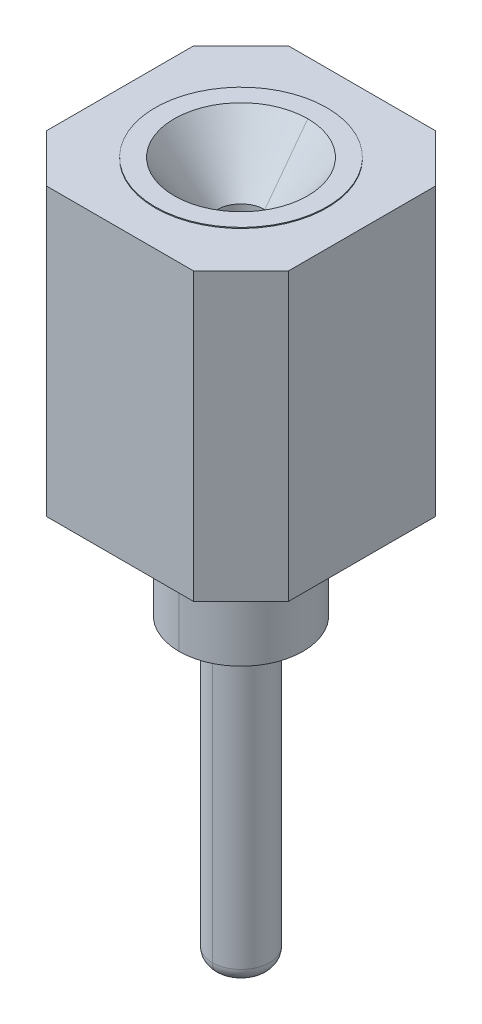
ISO-10303-21;
HEADER;
FILE_DESCRIPTION(('STEP AP214'),'2;1');
FILE_NAME('part.step','',(''),(''),'','','');
FILE_SCHEMA(('AUTOMOTIVE_DESIGN { 1 0 10303 214 1 1 1 1 }'));
ENDSEC;
DATA;
#1=APPLICATION_CONTEXT('core data for automotive mechanical design processes');
#2=APPLICATION_PROTOCOL_DEFINITION('international standard','automotive_design',2000,#1);
#3=PRODUCT_CONTEXT('',#1,'mechanical');
#4=PRODUCT('Part','Part','',(#3));
#5=PRODUCT_RELATED_PRODUCT_CATEGORY('part','',(#4));
#6=PRODUCT_DEFINITION_FORMATION('','',#4);
#7=PRODUCT_DEFINITION_CONTEXT('part definition',#1,'design');
#8=PRODUCT_DEFINITION('design','',#6,#7);
#9=PRODUCT_DEFINITION_SHAPE('','',#8);
#10=(LENGTH_UNIT() NAMED_UNIT(*) SI_UNIT(.MILLI.,.METRE.));
#11=(NAMED_UNIT(*) PLANE_ANGLE_UNIT() SI_UNIT($,.RADIAN.));
#12=(NAMED_UNIT(*) SI_UNIT($,.STERADIAN.) SOLID_ANGLE_UNIT());
#13=UNCERTAINTY_MEASURE_WITH_UNIT(LENGTH_MEASURE(1.E-05),#10,'distance_accuracy_value','');
#14=(GEOMETRIC_REPRESENTATION_CONTEXT(3) GLOBAL_UNCERTAINTY_ASSIGNED_CONTEXT((#13)) GLOBAL_UNIT_ASSIGNED_CONTEXT((#10,
#11,#12)) REPRESENTATION_CONTEXT('',''));
#15=CARTESIAN_POINT('',(0.,0.,0.));
#16=DIRECTION('',(0.,0.,1.));
#17=DIRECTION('',(1.,0.,0.));
#18=AXIS2_PLACEMENT_3D('',#15,#16,#17);
#19=CARTESIAN_POINT('',(0.,-2.85,0.));
#20=DIRECTION('',(0.,1.,0.));
#21=DIRECTION('',(0.,0.,1.));
#22=AXIS2_PLACEMENT_3D('',#19,#20,#21);
#23=DEGENERATE_TOROIDAL_SURFACE('',#22,0.149999999999997,0.15,.T.);
#24=CARTESIAN_POINT('',(0.,-3.,0.));
#25=DIRECTION('',(0.,-1.,0.));
#26=DIRECTION('',(0.,0.,1.));
#27=AXIS2_PLACEMENT_3D('',#24,#25,#26);
#28=CIRCLE('',#27,0.149999999999997);
#29=CARTESIAN_POINT('',(0.,-3.,-0.149999999999997));
#30=VERTEX_POINT('',#29);
#31=CARTESIAN_POINT('',(0.,-3.,0.149999999999997));
#32=VERTEX_POINT('',#31);
#33=EDGE_CURVE('E11',#30,#32,#28,.T.);
#34=ORIENTED_EDGE('',*,*,#33,.F.);
#35=CARTESIAN_POINT('',(0.,-2.85,-0.149999999999997));
#36=DIRECTION('',(1.,0.,0.));
#37=DIRECTION('',(0.,0.,-1.));
#38=AXIS2_PLACEMENT_3D('',#35,#36,#37);
#39=CIRCLE('',#38,0.15);
#40=CARTESIAN_POINT('',(0.,-2.85,-0.299999999999997));
#41=VERTEX_POINT('',#40);
#42=EDGE_CURVE('E24',#30,#41,#39,.T.);
#43=ORIENTED_EDGE('',*,*,#42,.T.);
#44=CARTESIAN_POINT('',(0.,-2.85,0.));
#45=DIRECTION('',(0.,1.,0.));
#46=DIRECTION('',(0.,0.,1.));
#47=AXIS2_PLACEMENT_3D('',#44,#45,#46);
#48=CIRCLE('',#47,0.299999999999997);
#49=CARTESIAN_POINT('',(0.,-2.85,0.299999999999997));
#50=VERTEX_POINT('',#49);
#51=EDGE_CURVE('E288',#50,#41,#48,.T.);
#52=ORIENTED_EDGE('',*,*,#51,.F.);
#53=CARTESIAN_POINT('',(0.,-2.85,0.149999999999997));
#54=DIRECTION('',(-1.,0.,0.));
#55=DIRECTION('',(0.,0.,1.));
#56=AXIS2_PLACEMENT_3D('',#53,#54,#55);
#57=CIRCLE('',#56,0.15);
#58=EDGE_CURVE('E285',#32,#50,#57,.T.);
#59=ORIENTED_EDGE('',*,*,#58,.F.);
#60=EDGE_LOOP('',(#34,#43,#52,#59));
#61=FACE_BOUND('',#60,.T.);
#62=ADVANCED_FACE('F17',(#61),#23,.T.);
#63=CARTESIAN_POINT('',(0.,-3.,0.));
#64=DIRECTION('',(0.,1.,0.));
#65=DIRECTION('',(0.,0.,1.));
#66=AXIS2_PLACEMENT_3D('',#63,#64,#65);
#67=CYLINDRICAL_SURFACE('',#66,0.299999999999997);
#68=ORIENTED_EDGE('',*,*,#51,.T.);
#69=DIRECTION('',(0.,1.,0.));
#70=VECTOR('',#69,1.);
#71=CARTESIAN_POINT('',(0.,-3.,-0.299999999999997));
#72=LINE('',#71,#70);
#73=CARTESIAN_POINT('',(0.,0.,-0.299999999999997));
#74=VERTEX_POINT('',#73);
#75=EDGE_CURVE('E283',#41,#74,#72,.T.);
#76=ORIENTED_EDGE('',*,*,#75,.T.);
#77=CARTESIAN_POINT('',(0.,0.,0.));
#78=DIRECTION('',(0.,-1.,0.));
#79=DIRECTION('',(0.,0.,1.));
#80=AXIS2_PLACEMENT_3D('',#77,#78,#79);
#81=CIRCLE('',#80,0.299999999999997);
#82=CARTESIAN_POINT('',(0.,0.,0.299999999999997));
#83=VERTEX_POINT('',#82);
#84=EDGE_CURVE('E281',#74,#83,#81,.T.);
#85=ORIENTED_EDGE('',*,*,#84,.T.);
#86=DIRECTION('',(0.,1.,0.));
#87=VECTOR('',#86,1.);
#88=CARTESIAN_POINT('',(0.,-3.,0.299999999999997));
#89=LINE('',#88,#87);
#90=EDGE_CURVE('E278',#50,#83,#89,.T.);
#91=ORIENTED_EDGE('',*,*,#90,.F.);
#92=EDGE_LOOP('',(#68,#76,#85,#91));
#93=FACE_BOUND('',#92,.T.);
#94=ADVANCED_FACE('F296',(#93),#67,.T.);
#95=CARTESIAN_POINT('',(0.,0.15,0.));
#96=DIRECTION('',(0.,1.,0.));
#97=DIRECTION('',(0.,0.,1.));
#98=AXIS2_PLACEMENT_3D('',#95,#96,#97);
#99=CONICAL_SURFACE('',#98,0.65,1.16590454050982);
#100=ORIENTED_EDGE('',*,*,#84,.F.);
#101=DIRECTION('',(0.,0.393919298579166,-0.919145030018059));
#102=VECTOR('',#101,1.);
#103=CARTESIAN_POINT('',(0.,0.15,-0.65));
#104=LINE('',#103,#102);
#105=CARTESIAN_POINT('',(0.,0.15,-0.65));
#106=VERTEX_POINT('',#105);
#107=EDGE_CURVE('E276',#74,#106,#104,.T.);
#108=ORIENTED_EDGE('',*,*,#107,.T.);
#109=CARTESIAN_POINT('',(0.,0.15,0.));
#110=DIRECTION('',(0.,1.,0.));
#111=DIRECTION('',(0.,0.,1.));
#112=AXIS2_PLACEMENT_3D('',#109,#110,#111);
#113=CIRCLE('',#112,0.65);
#114=CARTESIAN_POINT('',(0.,0.15,0.65));
#115=VERTEX_POINT('',#114);
#116=EDGE_CURVE('E273',#115,#106,#113,.T.);
#117=ORIENTED_EDGE('',*,*,#116,.F.);
#118=DIRECTION('',(0.,0.393919298579166,0.919145030018059));
#119=VECTOR('',#118,1.);
#120=CARTESIAN_POINT('',(0.,0.15,0.65));
#121=LINE('',#120,#119);
#122=EDGE_CURVE('E270',#83,#115,#121,.T.);
#123=ORIENTED_EDGE('',*,*,#122,.F.);
#124=EDGE_LOOP('',(#100,#108,#117,#123));
#125=FACE_BOUND('',#124,.T.);
#126=ADVANCED_FACE('F375',(#125),#99,.T.);
#127=CARTESIAN_POINT('',(0.,3.71,0.));
#128=DIRECTION('',(0.,1.,0.));
#129=DIRECTION('',(0.,0.,1.));
#130=AXIS2_PLACEMENT_3D('',#127,#128,#129);
#131=CONICAL_SURFACE('',#130,0.25,0.643501108793284);
#132=CARTESIAN_POINT('',(0.,3.71,0.));
#133=DIRECTION('',(0.,1.,0.));
#134=DIRECTION('',(0.,0.,1.));
#135=AXIS2_PLACEMENT_3D('',#132,#133,#134);
#136=CIRCLE('',#135,0.25);
#137=CARTESIAN_POINT('',(0.,3.71,-0.25));
#138=VERTEX_POINT('',#137);
#139=CARTESIAN_POINT('',(0.,3.71,0.25));
#140=VERTEX_POINT('',#139);
#141=EDGE_CURVE('E267',#138,#140,#136,.T.);
#142=ORIENTED_EDGE('',*,*,#141,.F.);
#143=DIRECTION('',(0.,0.8,-0.6));
#144=VECTOR('',#143,1.);
#145=CARTESIAN_POINT('',(0.,3.71,-0.25));
#146=LINE('',#145,#144);
#147=CARTESIAN_POINT('',(0.,4.31,-0.700000000000002));
#148=VERTEX_POINT('',#147);
#149=EDGE_CURVE('E264',#138,#148,#146,.T.);
#150=ORIENTED_EDGE('',*,*,#149,.T.);
#151=CARTESIAN_POINT('',(0.,4.31,0.));
#152=DIRECTION('',(0.,-1.,0.));
#153=DIRECTION('',(0.,0.,1.));
#154=AXIS2_PLACEMENT_3D('',#151,#152,#153);
#155=CIRCLE('',#154,0.700000000000002);
#156=CARTESIAN_POINT('',(0.,4.31,0.700000000000002));
#157=VERTEX_POINT('',#156);
#158=EDGE_CURVE('E262',#157,#148,#155,.T.);
#159=ORIENTED_EDGE('',*,*,#158,.F.);
#160=DIRECTION('',(0.,0.8,0.6));
#161=VECTOR('',#160,1.);
#162=CARTESIAN_POINT('',(0.,3.71,0.25));
#163=LINE('',#162,#161);
#164=EDGE_CURVE('E260',#140,#157,#163,.T.);
#165=ORIENTED_EDGE('',*,*,#164,.F.);
#166=EDGE_LOOP('',(#142,#150,#159,#165));
#167=FACE_BOUND('',#166,.T.);
#168=ADVANCED_FACE('F379',(#167),#131,.F.);
#169=CARTESIAN_POINT('',(0.,4.3,0.));
#170=DIRECTION('',(0.,-1.,0.));
#171=DIRECTION('',(0.,0.,-1.));
#172=AXIS2_PLACEMENT_3D('',#169,#170,#171);
#173=CYLINDRICAL_SURFACE('',#172,0.5);
#174=CARTESIAN_POINT('',(0.,2.3,0.));
#175=DIRECTION('',(0.,1.,0.));
#176=DIRECTION('',(0.,0.,1.));
#177=AXIS2_PLACEMENT_3D('',#174,#175,#176);
#178=CIRCLE('',#177,0.5);
#179=CARTESIAN_POINT('',(0.,2.3,-0.5));
#180=VERTEX_POINT('',#179);
#181=CARTESIAN_POINT('',(0.,2.3,0.5));
#182=VERTEX_POINT('',#181);
#183=EDGE_CURVE('E257',#180,#182,#178,.T.);
#184=ORIENTED_EDGE('',*,*,#183,.T.);
#185=DIRECTION('',(0.,-1.,0.));
#186=VECTOR('',#185,1.);
#187=CARTESIAN_POINT('',(0.,4.3,0.5));
#188=LINE('',#187,#186);
#189=CARTESIAN_POINT('',(0.,1.3,0.5));
#190=VERTEX_POINT('',#189);
#191=EDGE_CURVE('E254',#182,#190,#188,.T.);
#192=ORIENTED_EDGE('',*,*,#191,.T.);
#193=CARTESIAN_POINT('',(0.,1.3,0.));
#194=DIRECTION('',(0.,-1.,0.));
#195=DIRECTION('',(0.,0.,1.));
#196=AXIS2_PLACEMENT_3D('',#193,#194,#195);
#197=CIRCLE('',#196,0.5);
#198=CARTESIAN_POINT('',(0.,1.3,-0.5));
#199=VERTEX_POINT('',#198);
#200=EDGE_CURVE('E251',#190,#199,#197,.T.);
#201=ORIENTED_EDGE('',*,*,#200,.T.);
#202=DIRECTION('',(0.,-1.,0.));
#203=VECTOR('',#202,1.);
#204=CARTESIAN_POINT('',(0.,4.3,-0.5));
#205=LINE('',#204,#203);
#206=EDGE_CURVE('E249',#180,#199,#205,.T.);
#207=ORIENTED_EDGE('',*,*,#206,.F.);
#208=EDGE_LOOP('',(#184,#192,#201,#207));
#209=FACE_BOUND('',#208,.T.);
#210=ADVANCED_FACE('F385',(#209),#173,.F.);
#211=CARTESIAN_POINT('',(0.,2.3,0.));
#212=DIRECTION('',(0.,1.,0.));
#213=DIRECTION('',(0.,0.,1.));
#214=AXIS2_PLACEMENT_3D('',#211,#212,#213);
#215=CYLINDRICAL_SURFACE('',#214,0.25);
#216=CARTESIAN_POINT('',(0.,2.3,0.));
#217=DIRECTION('',(0.,1.,0.));
#218=DIRECTION('',(0.,0.,1.));
#219=AXIS2_PLACEMENT_3D('',#216,#217,#218);
#220=CIRCLE('',#219,0.25);
#221=CARTESIAN_POINT('',(0.,2.3,-0.25));
#222=VERTEX_POINT('',#221);
#223=CARTESIAN_POINT('',(0.,2.3,0.25));
#224=VERTEX_POINT('',#223);
#225=EDGE_CURVE('E246',#222,#224,#220,.T.);
#226=ORIENTED_EDGE('',*,*,#225,.F.);
#227=DIRECTION('',(0.,1.,0.));
#228=VECTOR('',#227,1.);
#229=CARTESIAN_POINT('',(0.,2.3,-0.25));
#230=LINE('',#229,#228);
#231=EDGE_CURVE('E243',#222,#138,#230,.T.);
#232=ORIENTED_EDGE('',*,*,#231,.T.);
#233=ORIENTED_EDGE('',*,*,#141,.T.);
#234=DIRECTION('',(0.,1.,0.));
#235=VECTOR('',#234,1.);
#236=CARTESIAN_POINT('',(0.,2.3,0.25));
#237=LINE('',#236,#235);
#238=EDGE_CURVE('E240',#224,#140,#237,.T.);
#239=ORIENTED_EDGE('',*,*,#238,.F.);
#240=EDGE_LOOP('',(#226,#232,#233,#239));
#241=FACE_BOUND('',#240,.T.);
#242=ADVANCED_FACE('F389',(#241),#215,.F.);
#243=CARTESIAN_POINT('',(0.,2.3,0.));
#244=DIRECTION('',(0.,1.,0.));
#245=DIRECTION('',(0.,0.,1.));
#246=AXIS2_PLACEMENT_3D('',#243,#244,#245);
#247=CYLINDRICAL_SURFACE('',#246,0.9);
#248=CARTESIAN_POINT('',(0.,4.3,0.));
#249=DIRECTION('',(0.,-1.,0.));
#250=DIRECTION('',(0.,0.,-1.));
#251=AXIS2_PLACEMENT_3D('',#248,#249,#250);
#252=CIRCLE('',#251,0.9);
#253=CARTESIAN_POINT('',(0.,4.3,-0.9));
#254=VERTEX_POINT('',#253);
#255=CARTESIAN_POINT('',(0.,4.3,0.9));
#256=VERTEX_POINT('',#255);
#257=EDGE_CURVE('E238',#254,#256,#252,.T.);
#258=ORIENTED_EDGE('',*,*,#257,.F.);
#259=DIRECTION('',(0.,1.,0.));
#260=VECTOR('',#259,1.);
#261=CARTESIAN_POINT('',(0.,2.3,-0.9));
#262=LINE('',#261,#260);
#263=CARTESIAN_POINT('',(0.,4.31,-0.9));
#264=VERTEX_POINT('',#263);
#265=EDGE_CURVE('E236',#254,#264,#262,.T.);
#266=ORIENTED_EDGE('',*,*,#265,.T.);
#267=CARTESIAN_POINT('',(0.,4.31,0.));
#268=DIRECTION('',(0.,1.,0.));
#269=DIRECTION('',(0.,0.,1.));
#270=AXIS2_PLACEMENT_3D('',#267,#268,#269);
#271=CIRCLE('',#270,0.9);
#272=CARTESIAN_POINT('',(0.,4.31,0.9));
#273=VERTEX_POINT('',#272);
#274=EDGE_CURVE('E233',#273,#264,#271,.T.);
#275=ORIENTED_EDGE('',*,*,#274,.F.);
#276=DIRECTION('',(0.,1.,0.));
#277=VECTOR('',#276,1.);
#278=CARTESIAN_POINT('',(0.,2.3,0.9));
#279=LINE('',#278,#277);
#280=EDGE_CURVE('E230',#256,#273,#279,.T.);
#281=ORIENTED_EDGE('',*,*,#280,.F.);
#282=EDGE_LOOP('',(#258,#266,#275,#281));
#283=FACE_BOUND('',#282,.T.);
#284=ADVANCED_FACE('F393',(#283),#247,.T.);
#285=CARTESIAN_POINT('',(0.,1.3,0.));
#286=DIRECTION('',(0.,-1.,0.));
#287=DIRECTION('',(0.,0.,-1.));
#288=AXIS2_PLACEMENT_3D('',#285,#286,#287);
#289=CYLINDRICAL_SURFACE('',#288,0.65);
#290=CARTESIAN_POINT('',(0.,1.3,0.));
#291=DIRECTION('',(0.,1.,0.));
#292=DIRECTION('',(0.,0.,1.));
#293=AXIS2_PLACEMENT_3D('',#290,#291,#292);
#294=CIRCLE('',#293,0.65);
#295=CARTESIAN_POINT('',(0.,1.3,0.65));
#296=VERTEX_POINT('',#295);
#297=CARTESIAN_POINT('',(0.,1.3,-0.65));
#298=VERTEX_POINT('',#297);
#299=EDGE_CURVE('E228',#296,#298,#294,.T.);
#300=ORIENTED_EDGE('',*,*,#299,.F.);
#301=DIRECTION('',(0.,-1.,0.));
#302=VECTOR('',#301,1.);
#303=CARTESIAN_POINT('',(0.,1.3,0.65));
#304=LINE('',#303,#302);
#305=EDGE_CURVE('E225',#296,#115,#304,.T.);
#306=ORIENTED_EDGE('',*,*,#305,.T.);
#307=ORIENTED_EDGE('',*,*,#116,.T.);
#308=DIRECTION('',(0.,-1.,0.));
#309=VECTOR('',#308,1.);
#310=CARTESIAN_POINT('',(0.,1.3,-0.65));
#311=LINE('',#310,#309);
#312=EDGE_CURVE('E222',#298,#106,#311,.T.);
#313=ORIENTED_EDGE('',*,*,#312,.F.);
#314=EDGE_LOOP('',(#300,#306,#307,#313));
#315=FACE_BOUND('',#314,.T.);
#316=ADVANCED_FACE('F397',(#315),#289,.T.);
#317=CARTESIAN_POINT('',(0.,1.3,0.));
#318=DIRECTION('',(0.,-1.,0.));
#319=DIRECTION('',(0.,0.,-1.));
#320=AXIS2_PLACEMENT_3D('',#317,#318,#319);
#321=CYLINDRICAL_SURFACE('',#320,0.65);
#322=ORIENTED_EDGE('',*,*,#305,.F.);
#323=CARTESIAN_POINT('',(0.,1.3,0.));
#324=DIRECTION('',(0.,1.,0.));
#325=DIRECTION('',(0.,0.,1.));
#326=AXIS2_PLACEMENT_3D('',#323,#324,#325);
#327=CIRCLE('',#326,0.65);
#328=EDGE_CURVE('E219',#298,#296,#327,.T.);
#329=ORIENTED_EDGE('',*,*,#328,.F.);
#330=ORIENTED_EDGE('',*,*,#312,.T.);
#331=CARTESIAN_POINT('',(0.,0.15,0.));
#332=DIRECTION('',(0.,1.,0.));
#333=DIRECTION('',(0.,0.,1.));
#334=AXIS2_PLACEMENT_3D('',#331,#332,#333);
#335=CIRCLE('',#334,0.65);
#336=EDGE_CURVE('E216',#106,#115,#335,.T.);
#337=ORIENTED_EDGE('',*,*,#336,.T.);
#338=EDGE_LOOP('',(#322,#329,#330,#337));
#339=FACE_BOUND('',#338,.T.);
#340=ADVANCED_FACE('F401',(#339),#321,.T.);
#341=CARTESIAN_POINT('',(0.,4.3,0.));
#342=DIRECTION('',(0.,-1.,0.));
#343=DIRECTION('',(0.,0.,-1.));
#344=AXIS2_PLACEMENT_3D('',#341,#342,#343);
#345=PLANE('',#344);
#346=CARTESIAN_POINT('',(0.,4.3,0.));
#347=DIRECTION('',(0.,-1.,0.));
#348=DIRECTION('',(0.,0.,-1.));
#349=AXIS2_PLACEMENT_3D('',#346,#347,#348);
#350=CIRCLE('',#349,0.9);
#351=EDGE_CURVE('E213',#256,#254,#350,.T.);
#352=ORIENTED_EDGE('',*,*,#351,.T.);
#353=ORIENTED_EDGE('',*,*,#257,.T.);
#354=EDGE_LOOP('',(#352,#353));
#355=FACE_BOUND('',#354,.T.);
#356=DIRECTION('',(-1.,0.,0.));
#357=VECTOR('',#356,1.);
#358=CARTESIAN_POINT('',(-0.77,4.3,-1.27));
#359=LINE('',#358,#357);
#360=CARTESIAN_POINT('',(0.77,4.3,-1.27));
#361=VERTEX_POINT('',#360);
#362=CARTESIAN_POINT('',(-0.77,4.3,-1.27));
#363=VERTEX_POINT('',#362);
#364=EDGE_CURVE('E211',#361,#363,#359,.T.);
#365=ORIENTED_EDGE('',*,*,#364,.T.);
#366=DIRECTION('',(-0.707106781186548,0.,0.707106781186548));
#367=VECTOR('',#366,1.);
#368=CARTESIAN_POINT('',(-1.27,4.3,-0.77));
#369=LINE('',#368,#367);
#370=CARTESIAN_POINT('',(-1.27,4.3,-0.77));
#371=VERTEX_POINT('',#370);
#372=EDGE_CURVE('E209',#363,#371,#369,.T.);
#373=ORIENTED_EDGE('',*,*,#372,.T.);
#374=DIRECTION('',(0.,0.,1.));
#375=VECTOR('',#374,1.);
#376=CARTESIAN_POINT('',(-1.27,4.3,-0.77));
#377=LINE('',#376,#375);
#378=CARTESIAN_POINT('',(-1.27,4.3,0.77));
#379=VERTEX_POINT('',#378);
#380=EDGE_CURVE('E171',#371,#379,#377,.T.);
#381=ORIENTED_EDGE('',*,*,#380,.T.);
#382=DIRECTION('',(0.707106781186548,0.,0.707106781186548));
#383=VECTOR('',#382,1.);
#384=CARTESIAN_POINT('',(-1.27,4.3,0.77));
#385=LINE('',#384,#383);
#386=CARTESIAN_POINT('',(-0.77,4.3,1.27));
#387=VERTEX_POINT('',#386);
#388=EDGE_CURVE('E206',#379,#387,#385,.T.);
#389=ORIENTED_EDGE('',*,*,#388,.T.);
#390=DIRECTION('',(1.,0.,0.));
#391=VECTOR('',#390,1.);
#392=CARTESIAN_POINT('',(-0.77,4.3,1.27));
#393=LINE('',#392,#391);
#394=CARTESIAN_POINT('',(0.77,4.3,1.27));
#395=VERTEX_POINT('',#394);
#396=EDGE_CURVE('E204',#387,#395,#393,.T.);
#397=ORIENTED_EDGE('',*,*,#396,.T.);
#398=DIRECTION('',(0.707106781186548,0.,-0.707106781186548));
#399=VECTOR('',#398,1.);
#400=CARTESIAN_POINT('',(0.77,4.3,1.27));
#401=LINE('',#400,#399);
#402=CARTESIAN_POINT('',(1.27,4.3,0.77));
#403=VERTEX_POINT('',#402);
#404=EDGE_CURVE('E202',#395,#403,#401,.T.);
#405=ORIENTED_EDGE('',*,*,#404,.T.);
#406=DIRECTION('',(0.,0.,-1.));
#407=VECTOR('',#406,1.);
#408=CARTESIAN_POINT('',(1.27,4.3,-0.77));
#409=LINE('',#408,#407);
#410=CARTESIAN_POINT('',(1.27,4.3,-0.77));
#411=VERTEX_POINT('',#410);
#412=EDGE_CURVE('E200',#403,#411,#409,.T.);
#413=ORIENTED_EDGE('',*,*,#412,.T.);
#414=DIRECTION('',(-0.707106781186548,0.,-0.707106781186548));
#415=VECTOR('',#414,1.);
#416=CARTESIAN_POINT('',(0.77,4.3,-1.27));
#417=LINE('',#416,#415);
#418=EDGE_CURVE('E197',#411,#361,#417,.T.);
#419=ORIENTED_EDGE('',*,*,#418,.T.);
#420=EDGE_LOOP('',(#365,#373,#381,#389,#397,#405,#413,#419));
#421=FACE_BOUND('',#420,.T.);
#422=ADVANCED_FACE('F347',(#355,#421),#345,.F.);
#423=CARTESIAN_POINT('',(0.,1.3,0.));
#424=DIRECTION('',(0.,-1.,0.));
#425=DIRECTION('',(0.,0.,-1.));
#426=AXIS2_PLACEMENT_3D('',#423,#424,#425);
#427=PLANE('',#426);
#428=ORIENTED_EDGE('',*,*,#328,.T.);
#429=ORIENTED_EDGE('',*,*,#299,.T.);
#430=EDGE_LOOP('',(#428,#429));
#431=FACE_BOUND('',#430,.T.);
#432=DIRECTION('',(-1.,0.,0.));
#433=VECTOR('',#432,1.);
#434=CARTESIAN_POINT('',(-0.77,1.3,-1.27));
#435=LINE('',#434,#433);
#436=CARTESIAN_POINT('',(0.77,1.3,-1.27));
#437=VERTEX_POINT('',#436);
#438=CARTESIAN_POINT('',(-0.77,1.3,-1.27));
#439=VERTEX_POINT('',#438);
#440=EDGE_CURVE('E195',#437,#439,#435,.T.);
#441=ORIENTED_EDGE('',*,*,#440,.F.);
#442=DIRECTION('',(-0.707106781186548,0.,-0.707106781186548));
#443=VECTOR('',#442,1.);
#444=CARTESIAN_POINT('',(0.77,1.3,-1.27));
#445=LINE('',#444,#443);
#446=CARTESIAN_POINT('',(1.27,1.3,-0.77));
#447=VERTEX_POINT('',#446);
#448=EDGE_CURVE('E192',#447,#437,#445,.T.);
#449=ORIENTED_EDGE('',*,*,#448,.F.);
#450=DIRECTION('',(0.,0.,-1.));
#451=VECTOR('',#450,1.);
#452=CARTESIAN_POINT('',(1.27,1.3,-0.77));
#453=LINE('',#452,#451);
#454=CARTESIAN_POINT('',(1.27,1.3,0.77));
#455=VERTEX_POINT('',#454);
#456=EDGE_CURVE('E189',#455,#447,#453,.T.);
#457=ORIENTED_EDGE('',*,*,#456,.F.);
#458=DIRECTION('',(0.707106781186548,0.,-0.707106781186548));
#459=VECTOR('',#458,1.);
#460=CARTESIAN_POINT('',(0.77,1.3,1.27));
#461=LINE('',#460,#459);
#462=CARTESIAN_POINT('',(0.77,1.3,1.27));
#463=VERTEX_POINT('',#462);
#464=EDGE_CURVE('E186',#463,#455,#461,.T.);
#465=ORIENTED_EDGE('',*,*,#464,.F.);
#466=DIRECTION('',(1.,0.,0.));
#467=VECTOR('',#466,1.);
#468=CARTESIAN_POINT('',(-0.77,1.3,1.27));
#469=LINE('',#468,#467);
#470=CARTESIAN_POINT('',(-0.77,1.3,1.27));
#471=VERTEX_POINT('',#470);
#472=EDGE_CURVE('E183',#471,#463,#469,.T.);
#473=ORIENTED_EDGE('',*,*,#472,.F.);
#474=DIRECTION('',(0.707106781186548,0.,0.707106781186548));
#475=VECTOR('',#474,1.);
#476=CARTESIAN_POINT('',(-1.27,1.3,0.77));
#477=LINE('',#476,#475);
#478=CARTESIAN_POINT('',(-1.27,1.3,0.77));
#479=VERTEX_POINT('',#478);
#480=EDGE_CURVE('E155',#479,#471,#477,.T.);
#481=ORIENTED_EDGE('',*,*,#480,.F.);
#482=DIRECTION('',(0.,0.,1.));
#483=VECTOR('',#482,1.);
#484=CARTESIAN_POINT('',(-1.27,1.3,-0.77));
#485=LINE('',#484,#483);
#486=CARTESIAN_POINT('',(-1.27,1.3,-0.77));
#487=VERTEX_POINT('',#486);
#488=EDGE_CURVE('E149',#487,#479,#485,.T.);
#489=ORIENTED_EDGE('',*,*,#488,.F.);
#490=DIRECTION('',(-0.707106781186548,0.,0.707106781186548));
#491=VECTOR('',#490,1.);
#492=CARTESIAN_POINT('',(-1.27,1.3,-0.77));
#493=LINE('',#492,#491);
#494=EDGE_CURVE('E152',#439,#487,#493,.T.);
#495=ORIENTED_EDGE('',*,*,#494,.F.);
#496=EDGE_LOOP('',(#441,#449,#457,#465,#473,#481,#489,#495));
#497=FACE_BOUND('',#496,.T.);
#498=ADVANCED_FACE('F151',(#431,#497),#427,.T.);
#499=CARTESIAN_POINT('',(-0.77,4.3,-1.27));
#500=DIRECTION('',(0.,0.,1.));
#501=DIRECTION('',(1.,0.,0.));
#502=AXIS2_PLACEMENT_3D('',#499,#500,#501);
#503=PLANE('',#502);
#504=ORIENTED_EDGE('',*,*,#440,.T.);
#505=DIRECTION('',(0.,-1.,0.));
#506=VECTOR('',#505,1.);
#507=CARTESIAN_POINT('',(-0.77,4.3,-1.27));
#508=LINE('',#507,#506);
#509=EDGE_CURVE('E167',#363,#439,#508,.T.);
#510=ORIENTED_EDGE('',*,*,#509,.F.);
#511=ORIENTED_EDGE('',*,*,#364,.F.);
#512=DIRECTION('',(0.,-1.,0.));
#513=VECTOR('',#512,1.);
#514=CARTESIAN_POINT('',(0.77,4.3,-1.27));
#515=LINE('',#514,#513);
#516=EDGE_CURVE('E172',#361,#437,#515,.T.);
#517=ORIENTED_EDGE('',*,*,#516,.T.);
#518=EDGE_LOOP('',(#504,#510,#511,#517));
#519=FACE_BOUND('',#518,.T.);
#520=ADVANCED_FACE('F350',(#519),#503,.F.);
#521=CARTESIAN_POINT('',(-1.27,4.3,-0.77));
#522=DIRECTION('',(0.707106781186548,0.,0.707106781186548));
#523=DIRECTION('',(0.707106781186548,0.,-0.707106781186548));
#524=AXIS2_PLACEMENT_3D('',#521,#522,#523);
#525=PLANE('',#524);
#526=ORIENTED_EDGE('',*,*,#494,.T.);
#527=DIRECTION('',(0.,-1.,0.));
#528=VECTOR('',#527,1.);
#529=CARTESIAN_POINT('',(-1.27,4.3,-0.77));
#530=LINE('',#529,#528);
#531=EDGE_CURVE('E165',#371,#487,#530,.T.);
#532=ORIENTED_EDGE('',*,*,#531,.F.);
#533=ORIENTED_EDGE('',*,*,#372,.F.);
#534=ORIENTED_EDGE('',*,*,#509,.T.);
#535=EDGE_LOOP('',(#526,#532,#533,#534));
#536=FACE_BOUND('',#535,.T.);
#537=ADVANCED_FACE('F163',(#536),#525,.F.);
#538=CARTESIAN_POINT('',(-1.27,4.3,-0.77));
#539=DIRECTION('',(1.,0.,0.));
#540=DIRECTION('',(0.,0.,-1.));
#541=AXIS2_PLACEMENT_3D('',#538,#539,#540);
#542=PLANE('',#541);
#543=ORIENTED_EDGE('',*,*,#488,.T.);
#544=DIRECTION('',(0.,-1.,0.));
#545=VECTOR('',#544,1.);
#546=CARTESIAN_POINT('',(-1.27,4.3,0.77));
#547=LINE('',#546,#545);
#548=EDGE_CURVE('E173',#379,#479,#547,.T.);
#549=ORIENTED_EDGE('',*,*,#548,.F.);
#550=ORIENTED_EDGE('',*,*,#380,.F.);
#551=ORIENTED_EDGE('',*,*,#531,.T.);
#552=EDGE_LOOP('',(#543,#549,#550,#551));
#553=FACE_BOUND('',#552,.T.);
#554=ADVANCED_FACE('F170',(#553),#542,.F.);
#555=CARTESIAN_POINT('',(-1.27,4.3,0.77));
#556=DIRECTION('',(0.707106781186548,0.,-0.707106781186548));
#557=DIRECTION('',(-0.707106781186548,0.,-0.707106781186548));
#558=AXIS2_PLACEMENT_3D('',#555,#556,#557);
#559=PLANE('',#558);
#560=ORIENTED_EDGE('',*,*,#480,.T.);
#561=DIRECTION('',(0.,-1.,0.));
#562=VECTOR('',#561,1.);
#563=CARTESIAN_POINT('',(-0.77,4.3,1.27));
#564=LINE('',#563,#562);
#565=EDGE_CURVE('E177',#387,#471,#564,.T.);
#566=ORIENTED_EDGE('',*,*,#565,.F.);
#567=ORIENTED_EDGE('',*,*,#388,.F.);
#568=ORIENTED_EDGE('',*,*,#548,.T.);
#569=EDGE_LOOP('',(#560,#566,#567,#568));
#570=FACE_BOUND('',#569,.T.);
#571=ADVANCED_FACE('F345',(#570),#559,.F.);
#572=CARTESIAN_POINT('',(-0.77,4.3,1.27));
#573=DIRECTION('',(0.,0.,-1.));
#574=DIRECTION('',(-1.,0.,0.));
#575=AXIS2_PLACEMENT_3D('',#572,#573,#574);
#576=PLANE('',#575);
#577=ORIENTED_EDGE('',*,*,#472,.T.);
#578=DIRECTION('',(0.,-1.,0.));
#579=VECTOR('',#578,1.);
#580=CARTESIAN_POINT('',(0.77,4.3,1.27));
#581=LINE('',#580,#579);
#582=EDGE_CURVE('E335',#395,#463,#581,.T.);
#583=ORIENTED_EDGE('',*,*,#582,.F.);
#584=ORIENTED_EDGE('',*,*,#396,.F.);
#585=ORIENTED_EDGE('',*,*,#565,.T.);
#586=EDGE_LOOP('',(#577,#583,#584,#585));
#587=FACE_BOUND('',#586,.T.);
#588=ADVANCED_FACE('F341',(#587),#576,.F.);
#589=CARTESIAN_POINT('',(0.77,4.3,1.27));
#590=DIRECTION('',(-0.707106781186548,0.,-0.707106781186548));
#591=DIRECTION('',(-0.707106781186548,0.,0.707106781186548));
#592=AXIS2_PLACEMENT_3D('',#589,#590,#591);
#593=PLANE('',#592);
#594=ORIENTED_EDGE('',*,*,#464,.T.);
#595=DIRECTION('',(0.,-1.,0.));
#596=VECTOR('',#595,1.);
#597=CARTESIAN_POINT('',(1.27,4.3,0.77));
#598=LINE('',#597,#596);
#599=EDGE_CURVE('E332',#403,#455,#598,.T.);
#600=ORIENTED_EDGE('',*,*,#599,.F.);
#601=ORIENTED_EDGE('',*,*,#404,.F.);
#602=ORIENTED_EDGE('',*,*,#582,.T.);
#603=EDGE_LOOP('',(#594,#600,#601,#602));
#604=FACE_BOUND('',#603,.T.);
#605=ADVANCED_FACE('F361',(#604),#593,.F.);
#606=CARTESIAN_POINT('',(1.27,4.3,-0.77));
#607=DIRECTION('',(-1.,0.,0.));
#608=DIRECTION('',(0.,0.,1.));
#609=AXIS2_PLACEMENT_3D('',#606,#607,#608);
#610=PLANE('',#609);
#611=ORIENTED_EDGE('',*,*,#456,.T.);
#612=DIRECTION('',(0.,-1.,0.));
#613=VECTOR('',#612,1.);
#614=CARTESIAN_POINT('',(1.27,4.3,-0.77));
#615=LINE('',#614,#613);
#616=EDGE_CURVE('E329',#411,#447,#615,.T.);
#617=ORIENTED_EDGE('',*,*,#616,.F.);
#618=ORIENTED_EDGE('',*,*,#412,.F.);
#619=ORIENTED_EDGE('',*,*,#599,.T.);
#620=EDGE_LOOP('',(#611,#617,#618,#619));
#621=FACE_BOUND('',#620,.T.);
#622=ADVANCED_FACE('F358',(#621),#610,.F.);
#623=CARTESIAN_POINT('',(0.77,4.3,-1.27));
#624=DIRECTION('',(-0.707106781186548,0.,0.707106781186548));
#625=DIRECTION('',(0.707106781186548,0.,0.707106781186548));
#626=AXIS2_PLACEMENT_3D('',#623,#624,#625);
#627=PLANE('',#626);
#628=ORIENTED_EDGE('',*,*,#448,.T.);
#629=ORIENTED_EDGE('',*,*,#516,.F.);
#630=ORIENTED_EDGE('',*,*,#418,.F.);
#631=ORIENTED_EDGE('',*,*,#616,.T.);
#632=EDGE_LOOP('',(#628,#629,#630,#631));
#633=FACE_BOUND('',#632,.T.);
#634=ADVANCED_FACE('F353',(#633),#627,.F.);
#635=CARTESIAN_POINT('',(0.,2.3,0.));
#636=DIRECTION('',(0.,1.,0.));
#637=DIRECTION('',(0.,0.,1.));
#638=AXIS2_PLACEMENT_3D('',#635,#636,#637);
#639=CYLINDRICAL_SURFACE('',#638,0.9);
#640=ORIENTED_EDGE('',*,*,#265,.F.);
#641=ORIENTED_EDGE('',*,*,#351,.F.);
#642=ORIENTED_EDGE('',*,*,#280,.T.);
#643=CARTESIAN_POINT('',(0.,4.31,0.));
#644=DIRECTION('',(0.,1.,0.));
#645=DIRECTION('',(0.,0.,1.));
#646=AXIS2_PLACEMENT_3D('',#643,#644,#645);
#647=CIRCLE('',#646,0.9);
#648=EDGE_CURVE('E326',#264,#273,#647,.T.);
#649=ORIENTED_EDGE('',*,*,#648,.F.);
#650=EDGE_LOOP('',(#640,#641,#642,#649));
#651=FACE_BOUND('',#650,.T.);
#652=ADVANCED_FACE('F454',(#651),#639,.T.);
#653=CARTESIAN_POINT('',(0.,2.3,0.));
#654=DIRECTION('',(0.,1.,0.));
#655=DIRECTION('',(0.,0.,1.));
#656=AXIS2_PLACEMENT_3D('',#653,#654,#655);
#657=PLANE('',#656);
#658=CARTESIAN_POINT('',(0.,2.3,0.));
#659=DIRECTION('',(0.,1.,0.));
#660=DIRECTION('',(0.,0.,1.));
#661=AXIS2_PLACEMENT_3D('',#658,#659,#660);
#662=CIRCLE('',#661,0.25);
#663=EDGE_CURVE('E323',#224,#222,#662,.T.);
#664=ORIENTED_EDGE('',*,*,#663,.T.);
#665=ORIENTED_EDGE('',*,*,#225,.T.);
#666=EDGE_LOOP('',(#664,#665));
#667=FACE_BOUND('',#666,.T.);
#668=ORIENTED_EDGE('',*,*,#183,.F.);
#669=CARTESIAN_POINT('',(0.,2.3,0.));
#670=DIRECTION('',(0.,1.,0.));
#671=DIRECTION('',(0.,0.,1.));
#672=AXIS2_PLACEMENT_3D('',#669,#670,#671);
#673=CIRCLE('',#672,0.5);
#674=EDGE_CURVE('E320',#182,#180,#673,.T.);
#675=ORIENTED_EDGE('',*,*,#674,.F.);
#676=EDGE_LOOP('',(#668,#675));
#677=FACE_BOUND('',#676,.T.);
#678=ADVANCED_FACE('F547',(#667,#677),#657,.F.);
#679=CARTESIAN_POINT('',(0.,2.3,0.));
#680=DIRECTION('',(0.,1.,0.));
#681=DIRECTION('',(0.,0.,1.));
#682=AXIS2_PLACEMENT_3D('',#679,#680,#681);
#683=CYLINDRICAL_SURFACE('',#682,0.25);
#684=ORIENTED_EDGE('',*,*,#231,.F.);
#685=ORIENTED_EDGE('',*,*,#663,.F.);
#686=ORIENTED_EDGE('',*,*,#238,.T.);
#687=CARTESIAN_POINT('',(0.,3.71,0.));
#688=DIRECTION('',(0.,1.,0.));
#689=DIRECTION('',(0.,0.,1.));
#690=AXIS2_PLACEMENT_3D('',#687,#688,#689);
#691=CIRCLE('',#690,0.25);
#692=EDGE_CURVE('E317',#140,#138,#691,.T.);
#693=ORIENTED_EDGE('',*,*,#692,.T.);
#694=EDGE_LOOP('',(#684,#685,#686,#693));
#695=FACE_BOUND('',#694,.T.);
#696=ADVANCED_FACE('F538',(#695),#683,.F.);
#697=CARTESIAN_POINT('',(0.,4.31,0.));
#698=DIRECTION('',(0.,1.,0.));
#699=DIRECTION('',(0.,0.,1.));
#700=AXIS2_PLACEMENT_3D('',#697,#698,#699);
#701=PLANE('',#700);
#702=ORIENTED_EDGE('',*,*,#158,.T.);
#703=CARTESIAN_POINT('',(0.,4.31,0.));
#704=DIRECTION('',(0.,-1.,0.));
#705=DIRECTION('',(0.,0.,1.));
#706=AXIS2_PLACEMENT_3D('',#703,#704,#705);
#707=CIRCLE('',#706,0.700000000000002);
#708=EDGE_CURVE('E314',#148,#157,#707,.T.);
#709=ORIENTED_EDGE('',*,*,#708,.T.);
#710=EDGE_LOOP('',(#702,#709));
#711=FACE_BOUND('',#710,.T.);
#712=ORIENTED_EDGE('',*,*,#274,.T.);
#713=ORIENTED_EDGE('',*,*,#648,.T.);
#714=EDGE_LOOP('',(#712,#713));
#715=FACE_BOUND('',#714,.T.);
#716=ADVANCED_FACE('F530',(#711,#715),#701,.T.);
#717=CARTESIAN_POINT('',(0.,1.3,0.));
#718=DIRECTION('',(0.,1.,0.));
#719=DIRECTION('',(0.,0.,1.));
#720=AXIS2_PLACEMENT_3D('',#717,#718,#719);
#721=PLANE('',#720);
#722=CARTESIAN_POINT('',(0.,1.3,0.));
#723=DIRECTION('',(0.,-1.,0.));
#724=DIRECTION('',(0.,0.,1.));
#725=AXIS2_PLACEMENT_3D('',#722,#723,#724);
#726=CIRCLE('',#725,0.5);
#727=EDGE_CURVE('E308',#199,#190,#726,.T.);
#728=ORIENTED_EDGE('',*,*,#727,.F.);
#729=ORIENTED_EDGE('',*,*,#200,.F.);
#730=EDGE_LOOP('',(#728,#729));
#731=FACE_BOUND('',#730,.T.);
#732=ADVANCED_FACE('F467',(#731),#721,.T.);
#733=CARTESIAN_POINT('',(0.,4.3,0.));
#734=DIRECTION('',(0.,-1.,0.));
#735=DIRECTION('',(0.,0.,-1.));
#736=AXIS2_PLACEMENT_3D('',#733,#734,#735);
#737=CYLINDRICAL_SURFACE('',#736,0.5);
#738=ORIENTED_EDGE('',*,*,#191,.F.);
#739=ORIENTED_EDGE('',*,*,#674,.T.);
#740=ORIENTED_EDGE('',*,*,#206,.T.);
#741=ORIENTED_EDGE('',*,*,#727,.T.);
#742=EDGE_LOOP('',(#738,#739,#740,#741));
#743=FACE_BOUND('',#742,.T.);
#744=ADVANCED_FACE('F462',(#743),#737,.F.);
#745=CARTESIAN_POINT('',(0.,3.71,0.));
#746=DIRECTION('',(0.,1.,0.));
#747=DIRECTION('',(0.,0.,1.));
#748=AXIS2_PLACEMENT_3D('',#745,#746,#747);
#749=CONICAL_SURFACE('',#748,0.25,0.643501108793284);
#750=ORIENTED_EDGE('',*,*,#149,.F.);
#751=ORIENTED_EDGE('',*,*,#692,.F.);
#752=ORIENTED_EDGE('',*,*,#164,.T.);
#753=ORIENTED_EDGE('',*,*,#708,.F.);
#754=EDGE_LOOP('',(#750,#751,#752,#753));
#755=FACE_BOUND('',#754,.T.);
#756=ADVANCED_FACE('F466',(#755),#749,.F.);
#757=CARTESIAN_POINT('',(0.,0.15,0.));
#758=DIRECTION('',(0.,1.,0.));
#759=DIRECTION('',(0.,0.,1.));
#760=AXIS2_PLACEMENT_3D('',#757,#758,#759);
#761=CONICAL_SURFACE('',#760,0.65,1.16590454050982);
#762=ORIENTED_EDGE('',*,*,#107,.F.);
#763=CARTESIAN_POINT('',(0.,0.,0.));
#764=DIRECTION('',(0.,-1.,0.));
#765=DIRECTION('',(0.,0.,1.));
#766=AXIS2_PLACEMENT_3D('',#763,#764,#765);
#767=CIRCLE('',#766,0.299999999999997);
#768=EDGE_CURVE('E304',#83,#74,#767,.T.);
#769=ORIENTED_EDGE('',*,*,#768,.F.);
#770=ORIENTED_EDGE('',*,*,#122,.T.);
#771=ORIENTED_EDGE('',*,*,#336,.F.);
#772=EDGE_LOOP('',(#762,#769,#770,#771));
#773=FACE_BOUND('',#772,.T.);
#774=ADVANCED_FACE('F482',(#773),#761,.T.);
#775=CARTESIAN_POINT('',(0.,-3.,0.));
#776=DIRECTION('',(0.,1.,0.));
#777=DIRECTION('',(0.,0.,1.));
#778=AXIS2_PLACEMENT_3D('',#775,#776,#777);
#779=CYLINDRICAL_SURFACE('',#778,0.299999999999997);
#780=ORIENTED_EDGE('',*,*,#75,.F.);
#781=CARTESIAN_POINT('',(0.,-2.85,0.));
#782=DIRECTION('',(0.,1.,0.));
#783=DIRECTION('',(0.,0.,1.));
#784=AXIS2_PLACEMENT_3D('',#781,#782,#783);
#785=CIRCLE('',#784,0.299999999999997);
#786=EDGE_CURVE('E302',#41,#50,#785,.T.);
#787=ORIENTED_EDGE('',*,*,#786,.T.);
#788=ORIENTED_EDGE('',*,*,#90,.T.);
#789=ORIENTED_EDGE('',*,*,#768,.T.);
#790=EDGE_LOOP('',(#780,#787,#788,#789));
#791=FACE_BOUND('',#790,.T.);
#792=ADVANCED_FACE('F301',(#791),#779,.T.);
#793=CARTESIAN_POINT('',(0.,-3.,0.));
#794=DIRECTION('',(0.,1.,0.));
#795=DIRECTION('',(0.,0.,1.));
#796=AXIS2_PLACEMENT_3D('',#793,#794,#795);
#797=PLANE('',#796);
#798=CARTESIAN_POINT('',(0.,-3.,0.));
#799=DIRECTION('',(0.,-1.,0.));
#800=DIRECTION('',(0.,0.,1.));
#801=AXIS2_PLACEMENT_3D('',#798,#799,#800);
#802=CIRCLE('',#801,0.149999999999997);
#803=EDGE_CURVE('E306',#32,#30,#802,.T.);
#804=ORIENTED_EDGE('',*,*,#803,.T.);
#805=ORIENTED_EDGE('',*,*,#33,.T.);
#806=EDGE_LOOP('',(#804,#805));
#807=FACE_BOUND('',#806,.T.);
#808=ADVANCED_FACE('F499',(#807),#797,.F.);
#809=CARTESIAN_POINT('',(0.,-2.85,0.));
#810=DIRECTION('',(0.,1.,0.));
#811=DIRECTION('',(0.,0.,1.));
#812=AXIS2_PLACEMENT_3D('',#809,#810,#811);
#813=DEGENERATE_TOROIDAL_SURFACE('',#812,0.149999999999997,0.15,.T.);
#814=ORIENTED_EDGE('',*,*,#42,.F.);
#815=ORIENTED_EDGE('',*,*,#803,.F.);
#816=ORIENTED_EDGE('',*,*,#58,.T.);
#817=ORIENTED_EDGE('',*,*,#786,.F.);
#818=EDGE_LOOP('',(#814,#815,#816,#817));
#819=FACE_BOUND('',#818,.T.);
#820=ADVANCED_FACE('F305',(#819),#813,.T.);
#821=CLOSED_SHELL('',(#62,#94,#126,#168,#210,#242,#284,#316,#340,#422,#498,#520,#537,#554,#571,
#588,#605,#622,#634,#652,#678,#696,#716,#732,#744,#756,#774,#792,#808,#820));
#822=MANIFOLD_SOLID_BREP('B1',#821);
#823=ADVANCED_BREP_SHAPE_REPRESENTATION('',(#18,#822),#14);
#824=SHAPE_DEFINITION_REPRESENTATION(#9,#823);
ENDSEC;
END-ISO-10303-21;
